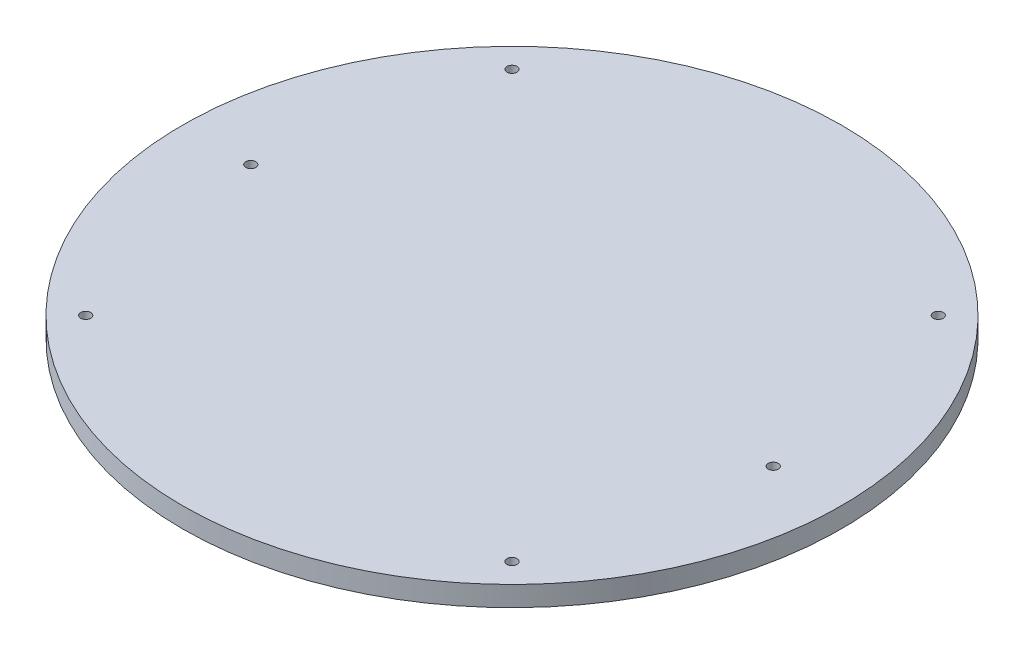
ISO-10303-21;
HEADER;
FILE_DESCRIPTION(('STEP AP214'),'2;1');
FILE_NAME('part.step','',(''),(''),'','','');
FILE_SCHEMA(('AUTOMOTIVE_DESIGN { 1 0 10303 214 1 1 1 1 }'));
ENDSEC;
DATA;
#1=APPLICATION_CONTEXT('core data for automotive mechanical design processes');
#2=APPLICATION_PROTOCOL_DEFINITION('international standard','automotive_design',2000,#1);
#3=PRODUCT_CONTEXT('',#1,'mechanical');
#4=PRODUCT('Part','Part','',(#3));
#5=PRODUCT_RELATED_PRODUCT_CATEGORY('part','',(#4));
#6=PRODUCT_DEFINITION_FORMATION('','',#4);
#7=PRODUCT_DEFINITION_CONTEXT('part definition',#1,'design');
#8=PRODUCT_DEFINITION('design','',#6,#7);
#9=PRODUCT_DEFINITION_SHAPE('','',#8);
#10=(LENGTH_UNIT() NAMED_UNIT(*) SI_UNIT(.MILLI.,.METRE.));
#11=(NAMED_UNIT(*) PLANE_ANGLE_UNIT() SI_UNIT($,.RADIAN.));
#12=(NAMED_UNIT(*) SI_UNIT($,.STERADIAN.) SOLID_ANGLE_UNIT());
#13=UNCERTAINTY_MEASURE_WITH_UNIT(LENGTH_MEASURE(1.E-05),#10,'distance_accuracy_value','');
#14=(GEOMETRIC_REPRESENTATION_CONTEXT(3) GLOBAL_UNCERTAINTY_ASSIGNED_CONTEXT((#13)) GLOBAL_UNIT_ASSIGNED_CONTEXT((#10,
#11,#12)) REPRESENTATION_CONTEXT('',''));
#15=CARTESIAN_POINT('',(0.,0.,0.));
#16=DIRECTION('',(0.,0.,1.));
#17=DIRECTION('',(1.,0.,0.));
#18=AXIS2_PLACEMENT_3D('',#15,#16,#17);
#19=CARTESIAN_POINT('',(0.,5.,0.));
#20=DIRECTION('',(0.,-1.,0.));
#21=DIRECTION('',(0.,0.,-1.));
#22=AXIS2_PLACEMENT_3D('',#19,#20,#21);
#23=CYLINDRICAL_SURFACE('',#22,82.);
#24=CARTESIAN_POINT('',(0.,5.,0.));
#25=DIRECTION('',(0.,1.,0.));
#26=DIRECTION('',(0.,0.,1.));
#27=AXIS2_PLACEMENT_3D('',#24,#25,#26);
#28=CIRCLE('',#27,82.);
#29=CARTESIAN_POINT('',(0.,5.,82.));
#30=VERTEX_POINT('',#29);
#31=EDGE_CURVE('E10',#30,#30,#28,.T.);
#32=ORIENTED_EDGE('',*,*,#31,.F.);
#33=EDGE_LOOP('',(#32));
#34=FACE_BOUND('',#33,.T.);
#35=CARTESIAN_POINT('',(0.,0.,0.));
#36=DIRECTION('',(0.,1.,0.));
#37=DIRECTION('',(0.,0.,1.));
#38=AXIS2_PLACEMENT_3D('',#35,#36,#37);
#39=CIRCLE('',#38,82.);
#40=CARTESIAN_POINT('',(0.,0.,82.));
#41=VERTEX_POINT('',#40);
#42=EDGE_CURVE('E42',#41,#41,#39,.T.);
#43=ORIENTED_EDGE('',*,*,#42,.T.);
#44=EDGE_LOOP('',(#43));
#45=FACE_BOUND('',#44,.T.);
#46=ADVANCED_FACE('F35',(#34,#45),#23,.T.);
#47=CARTESIAN_POINT('',(0.,5.,0.));
#48=DIRECTION('',(0.,1.,0.));
#49=DIRECTION('',(0.,0.,1.));
#50=AXIS2_PLACEMENT_3D('',#47,#48,#49);
#51=PLANE('',#50);
#52=CARTESIAN_POINT('',(65.,5.,0.));
#53=DIRECTION('',(0.,1.,0.));
#54=DIRECTION('',(0.,0.,-1.));
#55=AXIS2_PLACEMENT_3D('',#52,#53,#54);
#56=CIRCLE('',#55,1.25);
#57=CARTESIAN_POINT('',(65.,5.,-1.25));
#58=VERTEX_POINT('',#57);
#59=EDGE_CURVE('E76',#58,#58,#56,.T.);
#60=ORIENTED_EDGE('',*,*,#59,.F.);
#61=EDGE_LOOP('',(#60));
#62=FACE_BOUND('',#61,.T.);
#63=CARTESIAN_POINT('',(-65.,5.,0.));
#64=DIRECTION('',(0.,1.,0.));
#65=DIRECTION('',(0.,0.,1.));
#66=AXIS2_PLACEMENT_3D('',#63,#64,#65);
#67=CIRCLE('',#66,1.25);
#68=CARTESIAN_POINT('',(-65.,5.,1.25));
#69=VERTEX_POINT('',#68);
#70=EDGE_CURVE('E66',#69,#69,#67,.T.);
#71=ORIENTED_EDGE('',*,*,#70,.F.);
#72=EDGE_LOOP('',(#71));
#73=FACE_BOUND('',#72,.T.);
#74=CARTESIAN_POINT('',(-53.0330085889915,5.,53.0330085889906));
#75=DIRECTION('',(0.,1.,0.));
#76=DIRECTION('',(0.,0.,1.));
#77=AXIS2_PLACEMENT_3D('',#74,#75,#76);
#78=CIRCLE('',#77,1.25);
#79=CARTESIAN_POINT('',(-53.0330085889915,5.,54.2830085889906));
#80=VERTEX_POINT('',#79);
#81=EDGE_CURVE('E65',#80,#80,#78,.T.);
#82=ORIENTED_EDGE('',*,*,#81,.F.);
#83=EDGE_LOOP('',(#82));
#84=FACE_BOUND('',#83,.T.);
#85=CARTESIAN_POINT('',(53.0330085889908,5.,53.0330085889913));
#86=DIRECTION('',(0.,1.,0.));
#87=DIRECTION('',(0.,0.,1.));
#88=AXIS2_PLACEMENT_3D('',#85,#86,#87);
#89=CIRCLE('',#88,1.25);
#90=CARTESIAN_POINT('',(53.0330085889908,5.,54.2830085889913));
#91=VERTEX_POINT('',#90);
#92=EDGE_CURVE('E70',#91,#91,#89,.T.);
#93=ORIENTED_EDGE('',*,*,#92,.F.);
#94=EDGE_LOOP('',(#93));
#95=FACE_BOUND('',#94,.T.);
#96=CARTESIAN_POINT('',(53.0330085889912,5.,-53.033008588991));
#97=DIRECTION('',(0.,1.,0.));
#98=DIRECTION('',(0.,0.,1.));
#99=AXIS2_PLACEMENT_3D('',#96,#97,#98);
#100=CIRCLE('',#99,1.25);
#101=CARTESIAN_POINT('',(53.0330085889912,5.,-51.783008588991));
#102=VERTEX_POINT('',#101);
#103=EDGE_CURVE('E79',#102,#102,#100,.T.);
#104=ORIENTED_EDGE('',*,*,#103,.F.);
#105=EDGE_LOOP('',(#104));
#106=FACE_BOUND('',#105,.T.);
#107=CARTESIAN_POINT('',(-53.0330085889912,5.,-53.033008588991));
#108=DIRECTION('',(0.,1.,0.));
#109=DIRECTION('',(0.,0.,1.));
#110=AXIS2_PLACEMENT_3D('',#107,#108,#109);
#111=CIRCLE('',#110,1.25);
#112=CARTESIAN_POINT('',(-53.0330085889912,5.,-51.783008588991));
#113=VERTEX_POINT('',#112);
#114=EDGE_CURVE('E50',#113,#113,#111,.T.);
#115=ORIENTED_EDGE('',*,*,#114,.F.);
#116=EDGE_LOOP('',(#115));
#117=FACE_BOUND('',#116,.T.);
#118=ORIENTED_EDGE('',*,*,#31,.T.);
#119=EDGE_LOOP('',(#118));
#120=FACE_BOUND('',#119,.T.);
#121=ADVANCED_FACE('F88',(#62,#73,#84,#95,#106,#117,#120),#51,.T.);
#122=CARTESIAN_POINT('',(0.,0.,0.));
#123=DIRECTION('',(0.,1.,0.));
#124=DIRECTION('',(0.,0.,1.));
#125=AXIS2_PLACEMENT_3D('',#122,#123,#124);
#126=PLANE('',#125);
#127=CARTESIAN_POINT('',(65.,0.,0.));
#128=DIRECTION('',(0.,1.,0.));
#129=DIRECTION('',(0.,0.,1.));
#130=AXIS2_PLACEMENT_3D('',#127,#128,#129);
#131=CIRCLE('',#130,1.25);
#132=CARTESIAN_POINT('',(65.,0.,1.25));
#133=VERTEX_POINT('',#132);
#134=EDGE_CURVE('E38',#133,#133,#131,.T.);
#135=ORIENTED_EDGE('',*,*,#134,.T.);
#136=EDGE_LOOP('',(#135));
#137=FACE_BOUND('',#136,.T.);
#138=CARTESIAN_POINT('',(-65.,0.,0.));
#139=DIRECTION('',(0.,1.,0.));
#140=DIRECTION('',(0.,0.,1.));
#141=AXIS2_PLACEMENT_3D('',#138,#139,#140);
#142=CIRCLE('',#141,1.25);
#143=CARTESIAN_POINT('',(-65.,0.,1.25));
#144=VERTEX_POINT('',#143);
#145=EDGE_CURVE('E63',#144,#144,#142,.T.);
#146=ORIENTED_EDGE('',*,*,#145,.T.);
#147=EDGE_LOOP('',(#146));
#148=FACE_BOUND('',#147,.T.);
#149=CARTESIAN_POINT('',(-53.0330085889915,0.,53.0330085889906));
#150=DIRECTION('',(0.,1.,0.));
#151=DIRECTION('',(0.,0.,1.));
#152=AXIS2_PLACEMENT_3D('',#149,#150,#151);
#153=CIRCLE('',#152,1.25);
#154=CARTESIAN_POINT('',(-53.0330085889915,0.,54.2830085889906));
#155=VERTEX_POINT('',#154);
#156=EDGE_CURVE('E47',#155,#155,#153,.T.);
#157=ORIENTED_EDGE('',*,*,#156,.T.);
#158=EDGE_LOOP('',(#157));
#159=FACE_BOUND('',#158,.T.);
#160=CARTESIAN_POINT('',(53.0330085889908,0.,53.0330085889913));
#161=DIRECTION('',(0.,1.,0.));
#162=DIRECTION('',(0.,0.,1.));
#163=AXIS2_PLACEMENT_3D('',#160,#161,#162);
#164=CIRCLE('',#163,1.25);
#165=CARTESIAN_POINT('',(53.0330085889908,0.,54.2830085889913));
#166=VERTEX_POINT('',#165);
#167=EDGE_CURVE('E59',#166,#166,#164,.T.);
#168=ORIENTED_EDGE('',*,*,#167,.T.);
#169=EDGE_LOOP('',(#168));
#170=FACE_BOUND('',#169,.T.);
#171=CARTESIAN_POINT('',(53.0330085889912,0.,-53.033008588991));
#172=DIRECTION('',(0.,1.,0.));
#173=DIRECTION('',(0.,0.,1.));
#174=AXIS2_PLACEMENT_3D('',#171,#172,#173);
#175=CIRCLE('',#174,1.25);
#176=CARTESIAN_POINT('',(53.0330085889912,0.,-51.783008588991));
#177=VERTEX_POINT('',#176);
#178=EDGE_CURVE('E56',#177,#177,#175,.T.);
#179=ORIENTED_EDGE('',*,*,#178,.T.);
#180=EDGE_LOOP('',(#179));
#181=FACE_BOUND('',#180,.T.);
#182=CARTESIAN_POINT('',(-53.0330085889912,0.,-53.033008588991));
#183=DIRECTION('',(0.,1.,0.));
#184=DIRECTION('',(0.,0.,1.));
#185=AXIS2_PLACEMENT_3D('',#182,#183,#184);
#186=CIRCLE('',#185,1.25);
#187=CARTESIAN_POINT('',(-53.0330085889912,0.,-51.783008588991));
#188=VERTEX_POINT('',#187);
#189=EDGE_CURVE('E53',#188,#188,#186,.T.);
#190=ORIENTED_EDGE('',*,*,#189,.T.);
#191=EDGE_LOOP('',(#190));
#192=FACE_BOUND('',#191,.T.);
#193=ORIENTED_EDGE('',*,*,#42,.F.);
#194=EDGE_LOOP('',(#193));
#195=FACE_BOUND('',#194,.T.);
#196=ADVANCED_FACE('F91',(#137,#148,#159,#170,#181,#192,#195),#126,.F.);
#197=CARTESIAN_POINT('',(-53.0330085889912,-128.,-53.033008588991));
#198=DIRECTION('',(0.,1.,0.));
#199=DIRECTION('',(0.,0.,1.));
#200=AXIS2_PLACEMENT_3D('',#197,#198,#199);
#201=CYLINDRICAL_SURFACE('',#200,1.25);
#202=ORIENTED_EDGE('',*,*,#114,.T.);
#203=EDGE_LOOP('',(#202));
#204=FACE_BOUND('',#203,.T.);
#205=ORIENTED_EDGE('',*,*,#189,.F.);
#206=EDGE_LOOP('',(#205));
#207=FACE_BOUND('',#206,.T.);
#208=ADVANCED_FACE('F99',(#204,#207),#201,.F.);
#209=CARTESIAN_POINT('',(53.0330085889912,-128.,-53.033008588991));
#210=DIRECTION('',(0.,1.,0.));
#211=DIRECTION('',(0.,0.,1.));
#212=AXIS2_PLACEMENT_3D('',#209,#210,#211);
#213=CYLINDRICAL_SURFACE('',#212,1.25);
#214=ORIENTED_EDGE('',*,*,#103,.T.);
#215=EDGE_LOOP('',(#214));
#216=FACE_BOUND('',#215,.T.);
#217=ORIENTED_EDGE('',*,*,#178,.F.);
#218=EDGE_LOOP('',(#217));
#219=FACE_BOUND('',#218,.T.);
#220=ADVANCED_FACE('F102',(#216,#219),#213,.F.);
#221=CARTESIAN_POINT('',(53.0330085889908,-128.,53.0330085889913));
#222=DIRECTION('',(0.,1.,0.));
#223=DIRECTION('',(0.,0.,1.));
#224=AXIS2_PLACEMENT_3D('',#221,#222,#223);
#225=CYLINDRICAL_SURFACE('',#224,1.25);
#226=ORIENTED_EDGE('',*,*,#92,.T.);
#227=EDGE_LOOP('',(#226));
#228=FACE_BOUND('',#227,.T.);
#229=ORIENTED_EDGE('',*,*,#167,.F.);
#230=EDGE_LOOP('',(#229));
#231=FACE_BOUND('',#230,.T.);
#232=ADVANCED_FACE('F85',(#228,#231),#225,.F.);
#233=CARTESIAN_POINT('',(-53.0330085889915,-128.,53.0330085889906));
#234=DIRECTION('',(0.,1.,0.));
#235=DIRECTION('',(0.,0.,1.));
#236=AXIS2_PLACEMENT_3D('',#233,#234,#235);
#237=CYLINDRICAL_SURFACE('',#236,1.25);
#238=ORIENTED_EDGE('',*,*,#81,.T.);
#239=EDGE_LOOP('',(#238));
#240=FACE_BOUND('',#239,.T.);
#241=ORIENTED_EDGE('',*,*,#156,.F.);
#242=EDGE_LOOP('',(#241));
#243=FACE_BOUND('',#242,.T.);
#244=ADVANCED_FACE('F142',(#240,#243),#237,.F.);
#245=CARTESIAN_POINT('',(-65.,-5.,0.));
#246=DIRECTION('',(0.,1.,0.));
#247=DIRECTION('',(0.,0.,1.));
#248=AXIS2_PLACEMENT_3D('',#245,#246,#247);
#249=CYLINDRICAL_SURFACE('',#248,1.25);
#250=ORIENTED_EDGE('',*,*,#70,.T.);
#251=EDGE_LOOP('',(#250));
#252=FACE_BOUND('',#251,.T.);
#253=ORIENTED_EDGE('',*,*,#145,.F.);
#254=EDGE_LOOP('',(#253));
#255=FACE_BOUND('',#254,.T.);
#256=ADVANCED_FACE('F149',(#252,#255),#249,.F.);
#257=CARTESIAN_POINT('',(65.,-5.,0.));
#258=DIRECTION('',(0.,1.,0.));
#259=DIRECTION('',(0.,0.,1.));
#260=AXIS2_PLACEMENT_3D('',#257,#258,#259);
#261=CYLINDRICAL_SURFACE('',#260,1.25);
#262=ORIENTED_EDGE('',*,*,#59,.T.);
#263=EDGE_LOOP('',(#262));
#264=FACE_BOUND('',#263,.T.);
#265=ORIENTED_EDGE('',*,*,#134,.F.);
#266=EDGE_LOOP('',(#265));
#267=FACE_BOUND('',#266,.T.);
#268=ADVANCED_FACE('F156',(#264,#267),#261,.F.);
#269=CLOSED_SHELL('',(#46,#121,#196,#208,#220,#232,#244,#256,#268));
#270=MANIFOLD_SOLID_BREP('B2',#269);
#271=ADVANCED_BREP_SHAPE_REPRESENTATION('',(#18,#270),#14);
#272=SHAPE_DEFINITION_REPRESENTATION(#9,#271);
ENDSEC;
END-ISO-10303-21;
